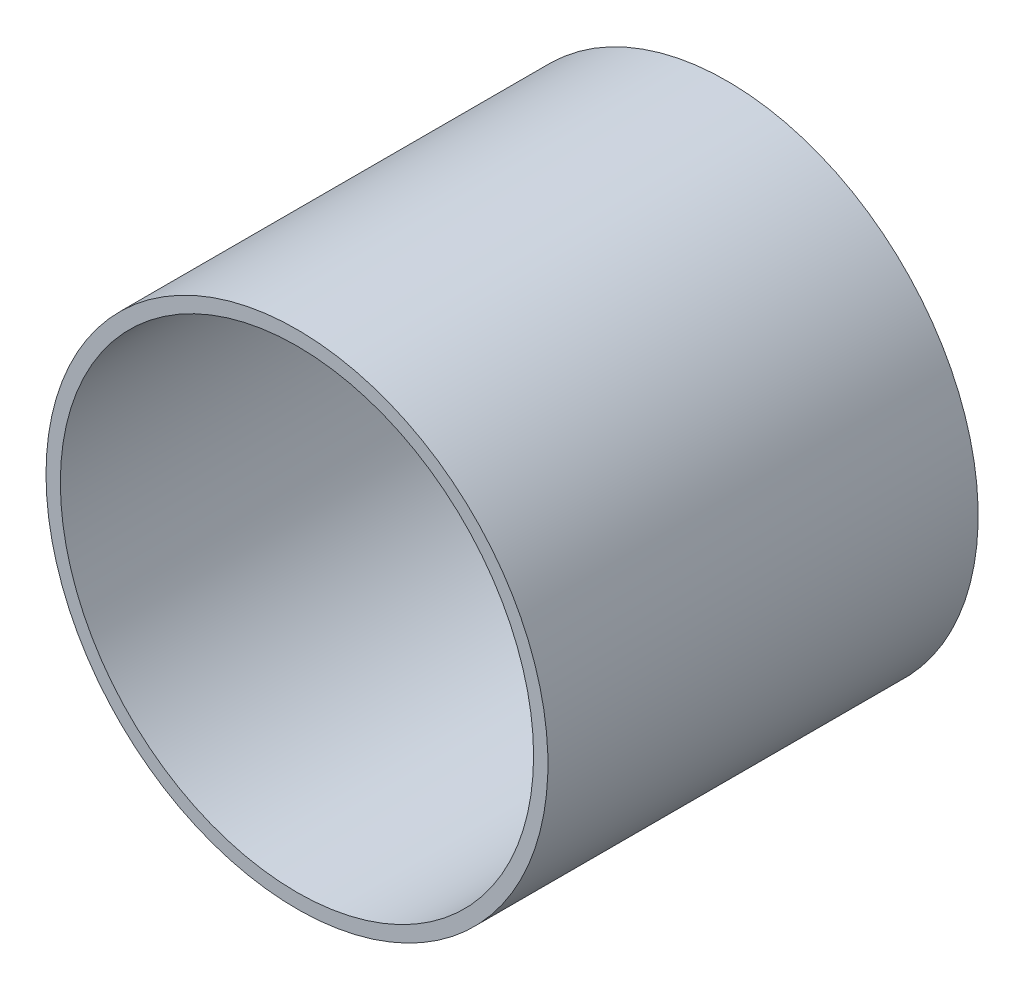
ISO-10303-21;
HEADER;
FILE_DESCRIPTION(('STEP AP214'),'2;1');
FILE_NAME('part.step','',(''),(''),'','','');
FILE_SCHEMA(('AUTOMOTIVE_DESIGN { 1 0 10303 214 1 1 1 1 }'));
ENDSEC;
DATA;
#1=APPLICATION_CONTEXT('core data for automotive mechanical design processes');
#2=APPLICATION_PROTOCOL_DEFINITION('international standard','automotive_design',2000,#1);
#3=PRODUCT_CONTEXT('',#1,'mechanical');
#4=PRODUCT('Part','Part','',(#3));
#5=PRODUCT_RELATED_PRODUCT_CATEGORY('part','',(#4));
#6=PRODUCT_DEFINITION_FORMATION('','',#4);
#7=PRODUCT_DEFINITION_CONTEXT('part definition',#1,'design');
#8=PRODUCT_DEFINITION('design','',#6,#7);
#9=PRODUCT_DEFINITION_SHAPE('','',#8);
#10=(LENGTH_UNIT() NAMED_UNIT(*) SI_UNIT(.MILLI.,.METRE.));
#11=(NAMED_UNIT(*) PLANE_ANGLE_UNIT() SI_UNIT($,.RADIAN.));
#12=(NAMED_UNIT(*) SI_UNIT($,.STERADIAN.) SOLID_ANGLE_UNIT());
#13=UNCERTAINTY_MEASURE_WITH_UNIT(LENGTH_MEASURE(1.E-05),#10,'distance_accuracy_value','');
#14=(GEOMETRIC_REPRESENTATION_CONTEXT(3) GLOBAL_UNCERTAINTY_ASSIGNED_CONTEXT((#13)) GLOBAL_UNIT_ASSIGNED_CONTEXT((#10,
#11,#12)) REPRESENTATION_CONTEXT('',''));
#15=CARTESIAN_POINT('',(0.,0.,0.));
#16=DIRECTION('',(0.,0.,1.));
#17=DIRECTION('',(1.,0.,0.));
#18=AXIS2_PLACEMENT_3D('',#15,#16,#17);
#19=CARTESIAN_POINT('',(0.,0.,76.2));
#20=DIRECTION('',(0.,0.,-1.));
#21=DIRECTION('',(-1.,0.,0.));
#22=AXIS2_PLACEMENT_3D('',#19,#20,#21);
#23=CYLINDRICAL_SURFACE('',#22,44.45);
#24=CARTESIAN_POINT('',(0.,0.,76.2));
#25=DIRECTION('',(0.,0.,1.));
#26=DIRECTION('',(1.,0.,0.));
#27=AXIS2_PLACEMENT_3D('',#24,#25,#26);
#28=CIRCLE('',#27,44.45);
#29=CARTESIAN_POINT('',(-44.45,0.,76.2));
#30=VERTEX_POINT('',#29);
#31=EDGE_CURVE('E10',#30,#30,#28,.T.);
#32=CARTESIAN_POINT('',(0.,0.,0.));
#33=DIRECTION('',(0.,0.,1.));
#34=DIRECTION('',(1.,0.,0.));
#35=AXIS2_PLACEMENT_3D('',#32,#33,#34);
#36=CIRCLE('',#35,44.45);
#37=CARTESIAN_POINT('',(-44.45,0.,0.));
#38=VERTEX_POINT('',#37);
#39=EDGE_CURVE('E47',#38,#38,#36,.T.);
#40=CARTESIAN_POINT('',(-44.45,0.,76.2));
#41=CARTESIAN_POINT('',(-44.45,0.,75.40625));
#42=CARTESIAN_POINT('',(-44.45,0.,74.6125));
#43=CARTESIAN_POINT('',(-44.45,0.,73.025));
#44=CARTESIAN_POINT('',(-44.45,0.,72.23125));
#45=CARTESIAN_POINT('',(-44.45,0.,70.64375));
#46=CARTESIAN_POINT('',(-44.45,0.,69.85));
#47=CARTESIAN_POINT('',(-44.45,0.,68.2625));
#48=CARTESIAN_POINT('',(-44.45,0.,67.46875));
#49=CARTESIAN_POINT('',(-44.45,0.,65.88125));
#50=CARTESIAN_POINT('',(-44.45,0.,65.0875));
#51=CARTESIAN_POINT('',(-44.45,0.,63.5));
#52=CARTESIAN_POINT('',(-44.45,0.,62.70625));
#53=CARTESIAN_POINT('',(-44.45,0.,61.11875));
#54=CARTESIAN_POINT('',(-44.45,0.,60.325));
#55=CARTESIAN_POINT('',(-44.45,0.,58.7375));
#56=CARTESIAN_POINT('',(-44.45,0.,57.94375));
#57=CARTESIAN_POINT('',(-44.45,0.,56.35625));
#58=CARTESIAN_POINT('',(-44.45,0.,55.5625));
#59=CARTESIAN_POINT('',(-44.45,0.,53.975));
#60=CARTESIAN_POINT('',(-44.45,0.,53.18125));
#61=CARTESIAN_POINT('',(-44.45,0.,51.59375));
#62=CARTESIAN_POINT('',(-44.45,0.,50.8));
#63=CARTESIAN_POINT('',(-44.45,0.,49.2125));
#64=CARTESIAN_POINT('',(-44.45,0.,48.41875));
#65=CARTESIAN_POINT('',(-44.45,0.,46.83125));
#66=CARTESIAN_POINT('',(-44.45,0.,46.0375));
#67=CARTESIAN_POINT('',(-44.45,0.,44.45));
#68=CARTESIAN_POINT('',(-44.45,0.,43.65625));
#69=CARTESIAN_POINT('',(-44.45,0.,42.06875));
#70=CARTESIAN_POINT('',(-44.45,0.,41.275));
#71=CARTESIAN_POINT('',(-44.45,0.,39.6875));
#72=CARTESIAN_POINT('',(-44.45,0.,38.89375));
#73=CARTESIAN_POINT('',(-44.45,0.,37.30625));
#74=CARTESIAN_POINT('',(-44.45,0.,36.5125));
#75=CARTESIAN_POINT('',(-44.45,0.,34.925));
#76=CARTESIAN_POINT('',(-44.45,0.,34.13125));
#77=CARTESIAN_POINT('',(-44.45,0.,32.54375));
#78=CARTESIAN_POINT('',(-44.45,0.,31.75));
#79=CARTESIAN_POINT('',(-44.45,0.,30.1625));
#80=CARTESIAN_POINT('',(-44.45,0.,29.36875));
#81=CARTESIAN_POINT('',(-44.45,0.,27.78125));
#82=CARTESIAN_POINT('',(-44.45,0.,26.9875));
#83=CARTESIAN_POINT('',(-44.45,0.,25.4));
#84=CARTESIAN_POINT('',(-44.45,0.,24.60625));
#85=CARTESIAN_POINT('',(-44.45,0.,23.01875));
#86=CARTESIAN_POINT('',(-44.45,0.,22.225));
#87=CARTESIAN_POINT('',(-44.45,0.,20.6375));
#88=CARTESIAN_POINT('',(-44.45,0.,19.84375));
#89=CARTESIAN_POINT('',(-44.45,0.,18.25625));
#90=CARTESIAN_POINT('',(-44.45,0.,17.4625));
#91=CARTESIAN_POINT('',(-44.45,0.,15.875));
#92=CARTESIAN_POINT('',(-44.45,0.,15.08125));
#93=CARTESIAN_POINT('',(-44.45,0.,13.49375));
#94=CARTESIAN_POINT('',(-44.45,0.,12.7));
#95=CARTESIAN_POINT('',(-44.45,0.,11.1125));
#96=CARTESIAN_POINT('',(-44.45,0.,10.31875));
#97=CARTESIAN_POINT('',(-44.45,0.,8.73125));
#98=CARTESIAN_POINT('',(-44.45,0.,7.93750000000001));
#99=CARTESIAN_POINT('',(-44.45,0.,6.35));
#100=CARTESIAN_POINT('',(-44.45,0.,5.55625));
#101=CARTESIAN_POINT('',(-44.45,0.,3.96875));
#102=CARTESIAN_POINT('',(-44.45,0.,3.175));
#103=CARTESIAN_POINT('',(-44.45,0.,1.5875));
#104=CARTESIAN_POINT('',(-44.45,0.,0.793750000000001));
#105=CARTESIAN_POINT('',(-44.45,0.,0.));
#106=B_SPLINE_CURVE_WITH_KNOTS('',3,(#40,#41,#42,#43,#44,#45,#46,#47,#48,#49,#50,#51,#52,#53,
#54,#55,#56,#57,#58,#59,#60,#61,#62,#63,#64,#65,#66,#67,#68,#69,#70,#71,#72,#73,#74,#75,#76,#77,
#78,#79,#80,#81,#82,#83,#84,#85,#86,#87,#88,#89,#90,#91,#92,#93,#94,#95,#96,#97,#98,#99,#100,
#101,#102,#103,#104,#105),.UNSPECIFIED.,.F.,.F.,(4,2,2,2,2,2,2,2,2,2,2,2,2,2,2,2,2,2,2,2,2,2,2,
2,2,2,2,2,2,2,2,2,4),(0.,2.38125,4.7625,7.14375,9.52500000000001,11.90625,14.2875,16.66875,
19.05,21.43125,23.8125,26.19375,28.575,30.95625,33.3375,35.71875,38.1,40.48125,42.8625,45.24375,
47.625,50.00625,52.3875,54.76875,57.15,59.53125,61.9125,64.29375,66.675,69.05625,71.4375,
73.81875,76.2),.UNSPECIFIED.);
#107=EDGE_CURVE('BSEAM39',#30,#38,#106,.T.);
#108=ORIENTED_EDGE('',*,*,#31,.F.);
#109=ORIENTED_EDGE('',*,*,#39,.T.);
#110=ORIENTED_EDGE('',*,*,#107,.T.);
#111=ORIENTED_EDGE('',*,*,#107,.F.);
#112=EDGE_LOOP('',(#108,#110,#109,#111));
#113=FACE_BOUND('',#112,.T.);
#114=ADVANCED_FACE('F39',(#113),#23,.T.);
#115=CARTESIAN_POINT('',(0.,0.,76.2));
#116=DIRECTION('',(0.,0.,1.));
#117=DIRECTION('',(1.,0.,0.));
#118=AXIS2_PLACEMENT_3D('',#115,#116,#117);
#119=PLANE('',#118);
#120=CARTESIAN_POINT('',(0.,0.,76.2));
#121=DIRECTION('',(0.,0.,1.));
#122=DIRECTION('',(1.,0.,0.));
#123=AXIS2_PLACEMENT_3D('',#120,#121,#122);
#124=CIRCLE('',#123,41.91);
#125=CARTESIAN_POINT('',(-41.91,0.,76.2));
#126=VERTEX_POINT('',#125);
#127=EDGE_CURVE('E42',#126,#126,#124,.T.);
#128=ORIENTED_EDGE('',*,*,#127,.F.);
#129=EDGE_LOOP('',(#128));
#130=FACE_BOUND('',#129,.T.);
#131=ORIENTED_EDGE('',*,*,#31,.T.);
#132=EDGE_LOOP('',(#131));
#133=FACE_BOUND('',#132,.T.);
#134=ADVANCED_FACE('F65',(#130,#133),#119,.T.);
#135=CARTESIAN_POINT('',(0.,0.,0.));
#136=DIRECTION('',(0.,0.,1.));
#137=DIRECTION('',(1.,0.,0.));
#138=AXIS2_PLACEMENT_3D('',#135,#136,#137);
#139=PLANE('',#138);
#140=CARTESIAN_POINT('',(0.,0.,0.));
#141=DIRECTION('',(0.,0.,1.));
#142=DIRECTION('',(1.,0.,0.));
#143=AXIS2_PLACEMENT_3D('',#140,#141,#142);
#144=CIRCLE('',#143,41.91);
#145=CARTESIAN_POINT('',(-41.91,0.,0.));
#146=VERTEX_POINT('',#145);
#147=EDGE_CURVE('E53',#146,#146,#144,.T.);
#148=ORIENTED_EDGE('',*,*,#147,.T.);
#149=EDGE_LOOP('',(#148));
#150=FACE_BOUND('',#149,.T.);
#151=ORIENTED_EDGE('',*,*,#39,.F.);
#152=EDGE_LOOP('',(#151));
#153=FACE_BOUND('',#152,.T.);
#154=ADVANCED_FACE('F67',(#150,#153),#139,.F.);
#155=CARTESIAN_POINT('',(0.,0.,76.2));
#156=DIRECTION('',(0.,0.,-1.));
#157=DIRECTION('',(-1.,0.,0.));
#158=AXIS2_PLACEMENT_3D('',#155,#156,#157);
#159=CYLINDRICAL_SURFACE('',#158,41.91);
#160=CARTESIAN_POINT('',(-41.91,0.,0.));
#161=CARTESIAN_POINT('',(-41.91,0.,0.793750000000001));
#162=CARTESIAN_POINT('',(-41.91,0.,1.5875));
#163=CARTESIAN_POINT('',(-41.91,0.,3.175));
#164=CARTESIAN_POINT('',(-41.91,0.,3.96875));
#165=CARTESIAN_POINT('',(-41.91,0.,5.55625));
#166=CARTESIAN_POINT('',(-41.91,0.,6.35));
#167=CARTESIAN_POINT('',(-41.91,0.,7.93750000000001));
#168=CARTESIAN_POINT('',(-41.91,0.,8.73125));
#169=CARTESIAN_POINT('',(-41.91,0.,10.31875));
#170=CARTESIAN_POINT('',(-41.91,0.,11.1125));
#171=CARTESIAN_POINT('',(-41.91,0.,12.7));
#172=CARTESIAN_POINT('',(-41.91,0.,13.49375));
#173=CARTESIAN_POINT('',(-41.91,0.,15.08125));
#174=CARTESIAN_POINT('',(-41.91,0.,15.875));
#175=CARTESIAN_POINT('',(-41.91,0.,17.4625));
#176=CARTESIAN_POINT('',(-41.91,0.,18.25625));
#177=CARTESIAN_POINT('',(-41.91,0.,19.84375));
#178=CARTESIAN_POINT('',(-41.91,0.,20.6375));
#179=CARTESIAN_POINT('',(-41.91,0.,22.225));
#180=CARTESIAN_POINT('',(-41.91,0.,23.01875));
#181=CARTESIAN_POINT('',(-41.91,0.,24.60625));
#182=CARTESIAN_POINT('',(-41.91,0.,25.4));
#183=CARTESIAN_POINT('',(-41.91,0.,26.9875));
#184=CARTESIAN_POINT('',(-41.91,0.,27.78125));
#185=CARTESIAN_POINT('',(-41.91,0.,29.36875));
#186=CARTESIAN_POINT('',(-41.91,0.,30.1625));
#187=CARTESIAN_POINT('',(-41.91,0.,31.75));
#188=CARTESIAN_POINT('',(-41.91,0.,32.54375));
#189=CARTESIAN_POINT('',(-41.91,0.,34.13125));
#190=CARTESIAN_POINT('',(-41.91,0.,34.925));
#191=CARTESIAN_POINT('',(-41.91,0.,36.5125));
#192=CARTESIAN_POINT('',(-41.91,0.,37.30625));
#193=CARTESIAN_POINT('',(-41.91,0.,38.89375));
#194=CARTESIAN_POINT('',(-41.91,0.,39.6875));
#195=CARTESIAN_POINT('',(-41.91,0.,41.275));
#196=CARTESIAN_POINT('',(-41.91,0.,42.06875));
#197=CARTESIAN_POINT('',(-41.91,0.,43.65625));
#198=CARTESIAN_POINT('',(-41.91,0.,44.45));
#199=CARTESIAN_POINT('',(-41.91,0.,46.0375));
#200=CARTESIAN_POINT('',(-41.91,0.,46.83125));
#201=CARTESIAN_POINT('',(-41.91,0.,48.41875));
#202=CARTESIAN_POINT('',(-41.91,0.,49.2125));
#203=CARTESIAN_POINT('',(-41.91,0.,50.8));
#204=CARTESIAN_POINT('',(-41.91,0.,51.59375));
#205=CARTESIAN_POINT('',(-41.91,0.,53.18125));
#206=CARTESIAN_POINT('',(-41.91,0.,53.975));
#207=CARTESIAN_POINT('',(-41.91,0.,55.5625));
#208=CARTESIAN_POINT('',(-41.91,0.,56.35625));
#209=CARTESIAN_POINT('',(-41.91,0.,57.94375));
#210=CARTESIAN_POINT('',(-41.91,0.,58.7375));
#211=CARTESIAN_POINT('',(-41.91,0.,60.325));
#212=CARTESIAN_POINT('',(-41.91,0.,61.11875));
#213=CARTESIAN_POINT('',(-41.91,0.,62.70625));
#214=CARTESIAN_POINT('',(-41.91,0.,63.5));
#215=CARTESIAN_POINT('',(-41.91,0.,65.0875));
#216=CARTESIAN_POINT('',(-41.91,0.,65.88125));
#217=CARTESIAN_POINT('',(-41.91,0.,67.46875));
#218=CARTESIAN_POINT('',(-41.91,0.,68.2625));
#219=CARTESIAN_POINT('',(-41.91,0.,69.85));
#220=CARTESIAN_POINT('',(-41.91,0.,70.64375));
#221=CARTESIAN_POINT('',(-41.91,0.,72.23125));
#222=CARTESIAN_POINT('',(-41.91,0.,73.025));
#223=CARTESIAN_POINT('',(-41.91,0.,74.6125));
#224=CARTESIAN_POINT('',(-41.91,0.,75.40625));
#225=CARTESIAN_POINT('',(-41.91,0.,76.2));
#226=B_SPLINE_CURVE_WITH_KNOTS('',3,(#160,#161,#162,#163,#164,#165,#166,#167,#168,#169,#170,
#171,#172,#173,#174,#175,#176,#177,#178,#179,#180,#181,#182,#183,#184,#185,#186,#187,#188,#189,
#190,#191,#192,#193,#194,#195,#196,#197,#198,#199,#200,#201,#202,#203,#204,#205,#206,#207,#208,
#209,#210,#211,#212,#213,#214,#215,#216,#217,#218,#219,#220,#221,#222,#223,#224,#225),
.UNSPECIFIED.,.F.,.F.,(4,2,2,2,2,2,2,2,2,2,2,2,2,2,2,2,2,2,2,2,2,2,2,2,2,2,2,2,2,2,2,2,4),(0.,
2.38125,4.7625,7.14375,9.52500000000001,11.90625,14.2875,16.66875,19.05,21.43125,23.8125,
26.19375,28.575,30.95625,33.3375,35.71875,38.1,40.48125,42.8625,45.24375,47.625,50.00625,
52.3875,54.76875,57.15,59.53125,61.9125,64.29375,66.675,69.05625,71.4375,73.81875,76.2),.UNSPECIFIED.);
#227=EDGE_CURVE('BSEAM63',#146,#126,#226,.T.);
#228=ORIENTED_EDGE('',*,*,#147,.F.);
#229=ORIENTED_EDGE('',*,*,#127,.T.);
#230=ORIENTED_EDGE('',*,*,#227,.T.);
#231=ORIENTED_EDGE('',*,*,#227,.F.);
#232=EDGE_LOOP('',(#228,#230,#229,#231));
#233=FACE_BOUND('',#232,.T.);
#234=ADVANCED_FACE('F63',(#233),#159,.F.);
#235=CLOSED_SHELL('',(#114,#134,#154,#234));
#236=MANIFOLD_SOLID_BREP('B2',#235);
#237=ADVANCED_BREP_SHAPE_REPRESENTATION('',(#18,#236),#14);
#238=SHAPE_DEFINITION_REPRESENTATION(#9,#237);
ENDSEC;
END-ISO-10303-21;
